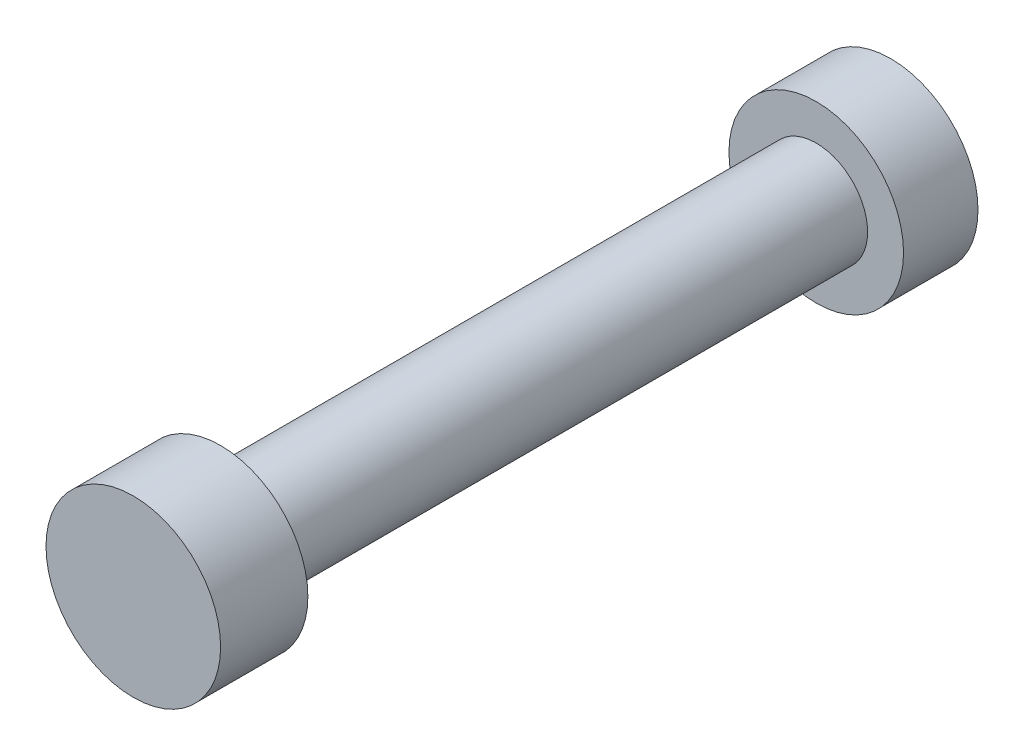
ISO-10303-21;
HEADER;
FILE_DESCRIPTION(('STEP AP214'),'2;1');
FILE_NAME('part.step','',(''),(''),'','','');
FILE_SCHEMA(('AUTOMOTIVE_DESIGN { 1 0 10303 214 1 1 1 1 }'));
ENDSEC;
DATA;
#1=APPLICATION_CONTEXT('core data for automotive mechanical design processes');
#2=APPLICATION_PROTOCOL_DEFINITION('international standard','automotive_design',2000,#1);
#3=PRODUCT_CONTEXT('',#1,'mechanical');
#4=PRODUCT('Part','Part','',(#3));
#5=PRODUCT_RELATED_PRODUCT_CATEGORY('part','',(#4));
#6=PRODUCT_DEFINITION_FORMATION('','',#4);
#7=PRODUCT_DEFINITION_CONTEXT('part definition',#1,'design');
#8=PRODUCT_DEFINITION('design','',#6,#7);
#9=PRODUCT_DEFINITION_SHAPE('','',#8);
#10=(LENGTH_UNIT() NAMED_UNIT(*) SI_UNIT(.MILLI.,.METRE.));
#11=(NAMED_UNIT(*) PLANE_ANGLE_UNIT() SI_UNIT($,.RADIAN.));
#12=(NAMED_UNIT(*) SI_UNIT($,.STERADIAN.) SOLID_ANGLE_UNIT());
#13=UNCERTAINTY_MEASURE_WITH_UNIT(LENGTH_MEASURE(1.E-05),#10,'distance_accuracy_value','');
#14=(GEOMETRIC_REPRESENTATION_CONTEXT(3) GLOBAL_UNCERTAINTY_ASSIGNED_CONTEXT((#13)) GLOBAL_UNIT_ASSIGNED_CONTEXT((#10,
#11,#12)) REPRESENTATION_CONTEXT('',''));
#15=CARTESIAN_POINT('',(0.,0.,0.));
#16=DIRECTION('',(0.,0.,1.));
#17=DIRECTION('',(1.,0.,0.));
#18=AXIS2_PLACEMENT_3D('',#15,#16,#17);
#19=CARTESIAN_POINT('',(0.,0.,65.));
#20=DIRECTION('',(0.,0.,-1.));
#21=DIRECTION('',(-1.,0.,0.));
#22=AXIS2_PLACEMENT_3D('',#19,#20,#21);
#23=CYLINDRICAL_SURFACE('',#22,2.);
#24=CARTESIAN_POINT('',(0.,0.,38.4));
#25=DIRECTION('',(0.,0.,1.));
#26=DIRECTION('',(1.,0.,0.));
#27=AXIS2_PLACEMENT_3D('',#24,#25,#26);
#28=CIRCLE('',#27,2.);
#29=CARTESIAN_POINT('',(2.,0.,38.4));
#30=VERTEX_POINT('',#29);
#31=EDGE_CURVE('E37',#30,#30,#28,.T.);
#32=ORIENTED_EDGE('',*,*,#31,.T.);
#33=EDGE_LOOP('',(#32));
#34=FACE_BOUND('',#33,.T.);
#35=CARTESIAN_POINT('',(0.,0.,61.6));
#36=DIRECTION('',(0.,0.,1.));
#37=DIRECTION('',(1.,0.,0.));
#38=AXIS2_PLACEMENT_3D('',#35,#36,#37);
#39=CIRCLE('',#38,2.);
#40=CARTESIAN_POINT('',(2.,0.,61.6));
#41=VERTEX_POINT('',#40);
#42=EDGE_CURVE('E10',#41,#41,#39,.T.);
#43=ORIENTED_EDGE('',*,*,#42,.F.);
#44=EDGE_LOOP('',(#43));
#45=FACE_BOUND('',#44,.T.);
#46=ADVANCED_FACE('F40',(#34,#45),#23,.T.);
#47=CARTESIAN_POINT('',(0.,0.,65.));
#48=DIRECTION('',(0.,0.,-1.));
#49=DIRECTION('',(-1.,0.,0.));
#50=AXIS2_PLACEMENT_3D('',#47,#48,#49);
#51=CYLINDRICAL_SURFACE('',#50,3.4);
#52=CARTESIAN_POINT('',(0.,0.,65.));
#53=DIRECTION('',(0.,0.,1.));
#54=DIRECTION('',(1.,0.,0.));
#55=AXIS2_PLACEMENT_3D('',#52,#53,#54);
#56=CIRCLE('',#55,3.4);
#57=CARTESIAN_POINT('',(3.4,0.,65.));
#58=VERTEX_POINT('',#57);
#59=EDGE_CURVE('E42',#58,#58,#56,.T.);
#60=ORIENTED_EDGE('',*,*,#59,.F.);
#61=EDGE_LOOP('',(#60));
#62=FACE_BOUND('',#61,.T.);
#63=CARTESIAN_POINT('',(0.,0.,61.6));
#64=DIRECTION('',(0.,0.,1.));
#65=DIRECTION('',(1.,0.,0.));
#66=AXIS2_PLACEMENT_3D('',#63,#64,#65);
#67=CIRCLE('',#66,3.4);
#68=CARTESIAN_POINT('',(3.4,0.,61.6));
#69=VERTEX_POINT('',#68);
#70=EDGE_CURVE('E48',#69,#69,#67,.T.);
#71=ORIENTED_EDGE('',*,*,#70,.T.);
#72=EDGE_LOOP('',(#71));
#73=FACE_BOUND('',#72,.T.);
#74=ADVANCED_FACE('F79',(#62,#73),#51,.T.);
#75=CARTESIAN_POINT('',(0.,0.,61.6));
#76=DIRECTION('',(0.,0.,1.));
#77=DIRECTION('',(1.,0.,0.));
#78=AXIS2_PLACEMENT_3D('',#75,#76,#77);
#79=PLANE('',#78);
#80=ORIENTED_EDGE('',*,*,#42,.T.);
#81=EDGE_LOOP('',(#80));
#82=FACE_BOUND('',#81,.T.);
#83=ORIENTED_EDGE('',*,*,#70,.F.);
#84=EDGE_LOOP('',(#83));
#85=FACE_BOUND('',#84,.T.);
#86=ADVANCED_FACE('F84',(#82,#85),#79,.F.);
#87=CARTESIAN_POINT('',(0.,0.,65.));
#88=DIRECTION('',(0.,0.,1.));
#89=DIRECTION('',(1.,0.,0.));
#90=AXIS2_PLACEMENT_3D('',#87,#88,#89);
#91=PLANE('',#90);
#92=ORIENTED_EDGE('',*,*,#59,.T.);
#93=EDGE_LOOP('',(#92));
#94=FACE_BOUND('',#93,.T.);
#95=ADVANCED_FACE('F73',(#94),#91,.T.);
#96=CARTESIAN_POINT('',(0.,0.,38.4));
#97=DIRECTION('',(0.,0.,-1.));
#98=DIRECTION('',(-1.,0.,0.));
#99=AXIS2_PLACEMENT_3D('',#96,#97,#98);
#100=CYLINDRICAL_SURFACE('',#99,3.4);
#101=CARTESIAN_POINT('',(0.,0.,38.4));
#102=DIRECTION('',(0.,0.,1.));
#103=DIRECTION('',(1.,0.,0.));
#104=AXIS2_PLACEMENT_3D('',#101,#102,#103);
#105=CIRCLE('',#104,3.4);
#106=CARTESIAN_POINT('',(3.4,0.,38.4));
#107=VERTEX_POINT('',#106);
#108=EDGE_CURVE('E57',#107,#107,#105,.T.);
#109=ORIENTED_EDGE('',*,*,#108,.F.);
#110=EDGE_LOOP('',(#109));
#111=FACE_BOUND('',#110,.T.);
#112=CARTESIAN_POINT('',(0.,0.,35.5));
#113=DIRECTION('',(0.,0.,1.));
#114=DIRECTION('',(1.,0.,0.));
#115=AXIS2_PLACEMENT_3D('',#112,#113,#114);
#116=CIRCLE('',#115,3.4);
#117=CARTESIAN_POINT('',(3.4,0.,35.5));
#118=VERTEX_POINT('',#117);
#119=EDGE_CURVE('E52',#118,#118,#116,.T.);
#120=ORIENTED_EDGE('',*,*,#119,.T.);
#121=EDGE_LOOP('',(#120));
#122=FACE_BOUND('',#121,.T.);
#123=ADVANCED_FACE('F66',(#111,#122),#100,.T.);
#124=CARTESIAN_POINT('',(0.,0.,38.4));
#125=DIRECTION('',(0.,0.,1.));
#126=DIRECTION('',(1.,0.,0.));
#127=AXIS2_PLACEMENT_3D('',#124,#125,#126);
#128=PLANE('',#127);
#129=ORIENTED_EDGE('',*,*,#31,.F.);
#130=EDGE_LOOP('',(#129));
#131=FACE_BOUND('',#130,.T.);
#132=ORIENTED_EDGE('',*,*,#108,.T.);
#133=EDGE_LOOP('',(#132));
#134=FACE_BOUND('',#133,.T.);
#135=ADVANCED_FACE('F62',(#131,#134),#128,.T.);
#136=CARTESIAN_POINT('',(0.,0.,35.5));
#137=DIRECTION('',(0.,0.,1.));
#138=DIRECTION('',(1.,0.,0.));
#139=AXIS2_PLACEMENT_3D('',#136,#137,#138);
#140=PLANE('',#139);
#141=ORIENTED_EDGE('',*,*,#119,.F.);
#142=EDGE_LOOP('',(#141));
#143=FACE_BOUND('',#142,.T.);
#144=ADVANCED_FACE('F70',(#143),#140,.F.);
#145=CLOSED_SHELL('',(#46,#74,#86,#95,#123,#135,#144));
#146=MANIFOLD_SOLID_BREP('B2',#145);
#147=ADVANCED_BREP_SHAPE_REPRESENTATION('',(#18,#146),#14);
#148=SHAPE_DEFINITION_REPRESENTATION(#9,#147);
ENDSEC;
END-ISO-10303-21;
